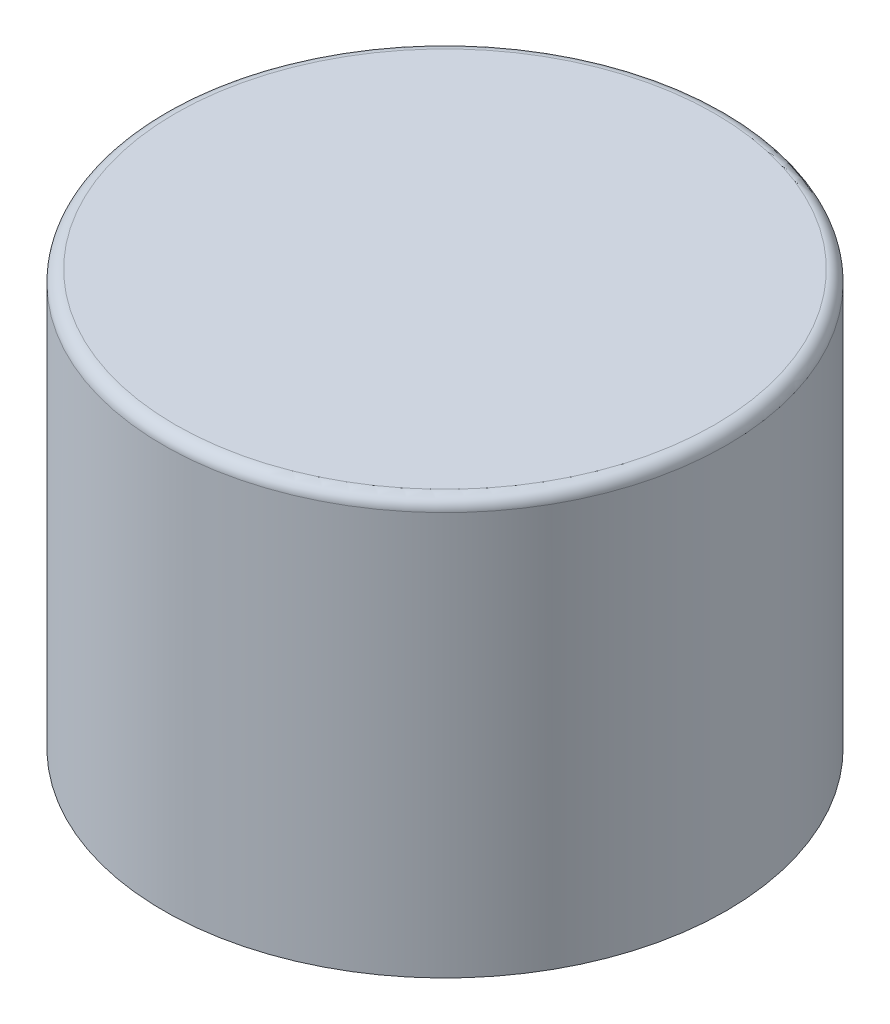
ISO-10303-21;
HEADER;
FILE_DESCRIPTION(('STEP AP214'),'2;1');
FILE_NAME('part.step','',(''),(''),'','','');
FILE_SCHEMA(('AUTOMOTIVE_DESIGN { 1 0 10303 214 1 1 1 1 }'));
ENDSEC;
DATA;
#1=APPLICATION_CONTEXT('core data for automotive mechanical design processes');
#2=APPLICATION_PROTOCOL_DEFINITION('international standard','automotive_design',2000,#1);
#3=PRODUCT_CONTEXT('',#1,'mechanical');
#4=PRODUCT('Part','Part','',(#3));
#5=PRODUCT_RELATED_PRODUCT_CATEGORY('part','',(#4));
#6=PRODUCT_DEFINITION_FORMATION('','',#4);
#7=PRODUCT_DEFINITION_CONTEXT('part definition',#1,'design');
#8=PRODUCT_DEFINITION('design','',#6,#7);
#9=PRODUCT_DEFINITION_SHAPE('','',#8);
#10=(LENGTH_UNIT() NAMED_UNIT(*) SI_UNIT(.MILLI.,.METRE.));
#11=(NAMED_UNIT(*) PLANE_ANGLE_UNIT() SI_UNIT($,.RADIAN.));
#12=(NAMED_UNIT(*) SI_UNIT($,.STERADIAN.) SOLID_ANGLE_UNIT());
#13=UNCERTAINTY_MEASURE_WITH_UNIT(LENGTH_MEASURE(1.E-05),#10,'distance_accuracy_value','');
#14=(GEOMETRIC_REPRESENTATION_CONTEXT(3) GLOBAL_UNCERTAINTY_ASSIGNED_CONTEXT((#13)) GLOBAL_UNIT_ASSIGNED_CONTEXT((#10,
#11,#12)) REPRESENTATION_CONTEXT('',''));
#15=CARTESIAN_POINT('',(0.,0.,0.));
#16=DIRECTION('',(0.,0.,1.));
#17=DIRECTION('',(1.,0.,0.));
#18=AXIS2_PLACEMENT_3D('',#15,#16,#17);
#19=CARTESIAN_POINT('',(0.,0.,0.));
#20=DIRECTION('',(0.,-1.,0.));
#21=DIRECTION('',(0.,0.,-1.));
#22=AXIS2_PLACEMENT_3D('',#19,#20,#21);
#23=PLANE('',#22);
#24=DIRECTION('',(-1.,0.,0.));
#25=VECTOR('',#24,1.);
#26=CARTESIAN_POINT('',(0.,0.,1.9));
#27=LINE('',#26,#25);
#28=CARTESIAN_POINT('',(1.9,0.,1.9));
#29=VERTEX_POINT('',#28);
#30=CARTESIAN_POINT('',(-1.9,0.,1.9));
#31=VERTEX_POINT('',#30);
#32=EDGE_CURVE('E9',#29,#31,#27,.T.);
#33=ORIENTED_EDGE('',*,*,#32,.F.);
#34=DIRECTION('',(0.,0.,1.));
#35=VECTOR('',#34,1.);
#36=CARTESIAN_POINT('',(1.9,0.,0.));
#37=LINE('',#36,#35);
#38=CARTESIAN_POINT('',(1.9,0.,-1.9));
#39=VERTEX_POINT('',#38);
#40=EDGE_CURVE('E107',#39,#29,#37,.T.);
#41=ORIENTED_EDGE('',*,*,#40,.F.);
#42=DIRECTION('',(1.,0.,0.));
#43=VECTOR('',#42,1.);
#44=CARTESIAN_POINT('',(0.,0.,-1.9));
#45=LINE('',#44,#43);
#46=CARTESIAN_POINT('',(-1.9,0.,-1.9));
#47=VERTEX_POINT('',#46);
#48=EDGE_CURVE('E61',#47,#39,#45,.T.);
#49=ORIENTED_EDGE('',*,*,#48,.F.);
#50=DIRECTION('',(0.,0.,-1.));
#51=VECTOR('',#50,1.);
#52=CARTESIAN_POINT('',(-1.9,0.,0.));
#53=LINE('',#52,#51);
#54=EDGE_CURVE('E24',#31,#47,#53,.T.);
#55=ORIENTED_EDGE('',*,*,#54,.F.);
#56=EDGE_LOOP('',(#33,#41,#49,#55));
#57=FACE_BOUND('',#56,.T.);
#58=CARTESIAN_POINT('',(0.,0.,0.));
#59=DIRECTION('',(0.,1.,0.));
#60=DIRECTION('',(1.,0.,0.));
#61=AXIS2_PLACEMENT_3D('',#58,#59,#60);
#62=CIRCLE('',#61,4.75);
#63=CARTESIAN_POINT('',(4.75,0.,0.));
#64=VERTEX_POINT('',#63);
#65=EDGE_CURVE('E103',#64,#64,#62,.T.);
#66=ORIENTED_EDGE('',*,*,#65,.F.);
#67=EDGE_LOOP('',(#66));
#68=FACE_BOUND('',#67,.T.);
#69=ADVANCED_FACE('F15',(#57,#68),#23,.T.);
#70=CARTESIAN_POINT('',(0.,0.,0.));
#71=DIRECTION('',(0.,1.,0.));
#72=DIRECTION('',(1.,0.,0.));
#73=AXIS2_PLACEMENT_3D('',#70,#71,#72);
#74=CYLINDRICAL_SURFACE('',#73,4.75);
#75=CARTESIAN_POINT('',(0.,6.8,0.));
#76=DIRECTION('',(0.,-1.,0.));
#77=DIRECTION('',(0.,0.,-1.));
#78=AXIS2_PLACEMENT_3D('',#75,#76,#77);
#79=CIRCLE('',#78,4.75);
#80=CARTESIAN_POINT('',(0.,6.8,-4.75));
#81=VERTEX_POINT('',#80);
#82=EDGE_CURVE('E99',#81,#81,#79,.T.);
#83=ORIENTED_EDGE('',*,*,#82,.T.);
#84=EDGE_LOOP('',(#83));
#85=FACE_BOUND('',#84,.T.);
#86=ORIENTED_EDGE('',*,*,#65,.T.);
#87=EDGE_LOOP('',(#86));
#88=FACE_BOUND('',#87,.T.);
#89=ADVANCED_FACE('F17',(#85,#88),#74,.T.);
#90=CARTESIAN_POINT('',(0.,6.8,0.));
#91=DIRECTION('',(0.,-1.,0.));
#92=DIRECTION('',(0.,0.,-1.));
#93=AXIS2_PLACEMENT_3D('',#90,#91,#92);
#94=TOROIDAL_SURFACE('',#93,4.55,0.2);
#95=CARTESIAN_POINT('',(0.,7.,0.));
#96=DIRECTION('',(0.,-1.,0.));
#97=DIRECTION('',(0.,0.,-1.));
#98=AXIS2_PLACEMENT_3D('',#95,#96,#97);
#99=CIRCLE('',#98,4.55);
#100=CARTESIAN_POINT('',(0.,7.,-4.55));
#101=VERTEX_POINT('',#100);
#102=EDGE_CURVE('E95',#101,#101,#99,.T.);
#103=ORIENTED_EDGE('',*,*,#102,.T.);
#104=EDGE_LOOP('',(#103));
#105=FACE_BOUND('',#104,.T.);
#106=ORIENTED_EDGE('',*,*,#82,.F.);
#107=EDGE_LOOP('',(#106));
#108=FACE_BOUND('',#107,.T.);
#109=ADVANCED_FACE('F128',(#105,#108),#94,.T.);
#110=CARTESIAN_POINT('',(0.,7.,0.));
#111=DIRECTION('',(0.,1.,0.));
#112=DIRECTION('',(0.,0.,1.));
#113=AXIS2_PLACEMENT_3D('',#110,#111,#112);
#114=PLANE('',#113);
#115=ORIENTED_EDGE('',*,*,#102,.F.);
#116=EDGE_LOOP('',(#115));
#117=FACE_BOUND('',#116,.T.);
#118=ADVANCED_FACE('F120',(#117),#114,.T.);
#119=CARTESIAN_POINT('',(0.,0.9,1.9));
#120=DIRECTION('',(0.,0.,1.));
#121=DIRECTION('',(1.,0.,0.));
#122=AXIS2_PLACEMENT_3D('',#119,#120,#121);
#123=PLANE('',#122);
#124=ORIENTED_EDGE('',*,*,#32,.T.);
#125=DIRECTION('',(0.,1.,0.));
#126=VECTOR('',#125,1.);
#127=CARTESIAN_POINT('',(-1.9,0.9,1.9));
#128=LINE('',#127,#126);
#129=CARTESIAN_POINT('',(-1.9,2.8,1.9));
#130=VERTEX_POINT('',#129);
#131=EDGE_CURVE('E92',#31,#130,#128,.T.);
#132=ORIENTED_EDGE('',*,*,#131,.T.);
#133=DIRECTION('',(1.,0.,0.));
#134=VECTOR('',#133,1.);
#135=CARTESIAN_POINT('',(0.,2.8,1.9));
#136=LINE('',#135,#134);
#137=CARTESIAN_POINT('',(1.9,2.8,1.9));
#138=VERTEX_POINT('',#137);
#139=EDGE_CURVE('E89',#130,#138,#136,.T.);
#140=ORIENTED_EDGE('',*,*,#139,.T.);
#141=DIRECTION('',(0.,-1.,0.));
#142=VECTOR('',#141,1.);
#143=CARTESIAN_POINT('',(1.9,0.9,1.9));
#144=LINE('',#143,#142);
#145=EDGE_CURVE('E69',#138,#29,#144,.T.);
#146=ORIENTED_EDGE('',*,*,#145,.T.);
#147=EDGE_LOOP('',(#124,#132,#140,#146));
#148=FACE_BOUND('',#147,.T.);
#149=ADVANCED_FACE('F118',(#148),#123,.F.);
#150=CARTESIAN_POINT('',(-1.9,0.9,-1.9));
#151=DIRECTION('',(-1.,0.,0.));
#152=DIRECTION('',(0.,0.,1.));
#153=AXIS2_PLACEMENT_3D('',#150,#151,#152);
#154=PLANE('',#153);
#155=ORIENTED_EDGE('',*,*,#54,.T.);
#156=DIRECTION('',(0.,-1.,0.));
#157=VECTOR('',#156,1.);
#158=CARTESIAN_POINT('',(-1.9,0.9,-1.9));
#159=LINE('',#158,#157);
#160=CARTESIAN_POINT('',(-1.9,2.8,-1.9));
#161=VERTEX_POINT('',#160);
#162=EDGE_CURVE('E78',#161,#47,#159,.T.);
#163=ORIENTED_EDGE('',*,*,#162,.F.);
#164=DIRECTION('',(0.,0.,1.));
#165=VECTOR('',#164,1.);
#166=CARTESIAN_POINT('',(-1.9,2.8,-1.9));
#167=LINE('',#166,#165);
#168=EDGE_CURVE('E73',#161,#130,#167,.T.);
#169=ORIENTED_EDGE('',*,*,#168,.T.);
#170=ORIENTED_EDGE('',*,*,#131,.F.);
#171=EDGE_LOOP('',(#155,#163,#169,#170));
#172=FACE_BOUND('',#171,.T.);
#173=ADVANCED_FACE('F115',(#172),#154,.F.);
#174=CARTESIAN_POINT('',(0.,2.8,-1.9));
#175=DIRECTION('',(0.,1.,0.));
#176=DIRECTION('',(0.,0.,1.));
#177=AXIS2_PLACEMENT_3D('',#174,#175,#176);
#178=PLANE('',#177);
#179=ORIENTED_EDGE('',*,*,#168,.F.);
#180=DIRECTION('',(-1.,0.,0.));
#181=VECTOR('',#180,1.);
#182=CARTESIAN_POINT('',(0.,2.8,-1.9));
#183=LINE('',#182,#181);
#184=CARTESIAN_POINT('',(1.9,2.8,-1.9));
#185=VERTEX_POINT('',#184);
#186=EDGE_CURVE('E58',#185,#161,#183,.T.);
#187=ORIENTED_EDGE('',*,*,#186,.F.);
#188=DIRECTION('',(0.,0.,1.));
#189=VECTOR('',#188,1.);
#190=CARTESIAN_POINT('',(1.9,2.8,-1.9));
#191=LINE('',#190,#189);
#192=EDGE_CURVE('E64',#185,#138,#191,.T.);
#193=ORIENTED_EDGE('',*,*,#192,.T.);
#194=ORIENTED_EDGE('',*,*,#139,.F.);
#195=EDGE_LOOP('',(#179,#187,#193,#194));
#196=FACE_BOUND('',#195,.T.);
#197=ADVANCED_FACE('F75',(#196),#178,.F.);
#198=CARTESIAN_POINT('',(0.,0.9,-1.9));
#199=DIRECTION('',(0.,0.,-1.));
#200=DIRECTION('',(-1.,0.,0.));
#201=AXIS2_PLACEMENT_3D('',#198,#199,#200);
#202=PLANE('',#201);
#203=ORIENTED_EDGE('',*,*,#48,.T.);
#204=DIRECTION('',(0.,1.,0.));
#205=VECTOR('',#204,1.);
#206=CARTESIAN_POINT('',(1.9,0.9,-1.9));
#207=LINE('',#206,#205);
#208=EDGE_CURVE('E31',#39,#185,#207,.T.);
#209=ORIENTED_EDGE('',*,*,#208,.T.);
#210=ORIENTED_EDGE('',*,*,#186,.T.);
#211=ORIENTED_EDGE('',*,*,#162,.T.);
#212=EDGE_LOOP('',(#203,#209,#210,#211));
#213=FACE_BOUND('',#212,.T.);
#214=ADVANCED_FACE('F55',(#213),#202,.F.);
#215=CARTESIAN_POINT('',(1.9,0.9,-1.9));
#216=DIRECTION('',(1.,0.,0.));
#217=DIRECTION('',(0.,0.,-1.));
#218=AXIS2_PLACEMENT_3D('',#215,#216,#217);
#219=PLANE('',#218);
#220=ORIENTED_EDGE('',*,*,#40,.T.);
#221=ORIENTED_EDGE('',*,*,#145,.F.);
#222=ORIENTED_EDGE('',*,*,#192,.F.);
#223=ORIENTED_EDGE('',*,*,#208,.F.);
#224=EDGE_LOOP('',(#220,#221,#222,#223));
#225=FACE_BOUND('',#224,.T.);
#226=ADVANCED_FACE('F68',(#225),#219,.F.);
#227=CLOSED_SHELL('',(#69,#89,#109,#118,#149,#173,#197,#214,#226));
#228=MANIFOLD_SOLID_BREP('B1',#227);
#229=ADVANCED_BREP_SHAPE_REPRESENTATION('',(#18,#228),#14);
#230=SHAPE_DEFINITION_REPRESENTATION(#9,#229);
ENDSEC;
END-ISO-10303-21;
